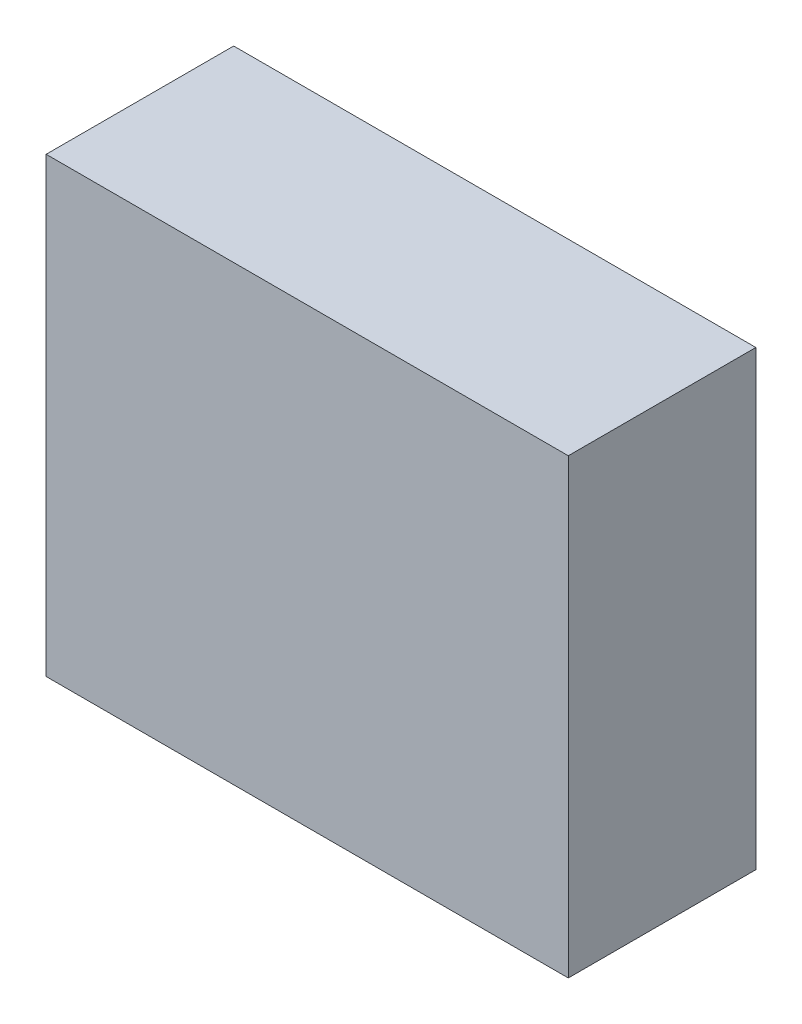
ISO-10303-21;
HEADER;
FILE_DESCRIPTION(('STEP AP214'),'2;1');
FILE_NAME('part.step','',(''),(''),'','','');
FILE_SCHEMA(('AUTOMOTIVE_DESIGN { 1 0 10303 214 1 1 1 1 }'));
ENDSEC;
DATA;
#1=APPLICATION_CONTEXT('core data for automotive mechanical design processes');
#2=APPLICATION_PROTOCOL_DEFINITION('international standard','automotive_design',2000,#1);
#3=PRODUCT_CONTEXT('',#1,'mechanical');
#4=PRODUCT('Part','Part','',(#3));
#5=PRODUCT_RELATED_PRODUCT_CATEGORY('part','',(#4));
#6=PRODUCT_DEFINITION_FORMATION('','',#4);
#7=PRODUCT_DEFINITION_CONTEXT('part definition',#1,'design');
#8=PRODUCT_DEFINITION('design','',#6,#7);
#9=PRODUCT_DEFINITION_SHAPE('','',#8);
#10=(LENGTH_UNIT() NAMED_UNIT(*) SI_UNIT(.MILLI.,.METRE.));
#11=(NAMED_UNIT(*) PLANE_ANGLE_UNIT() SI_UNIT($,.RADIAN.));
#12=(NAMED_UNIT(*) SI_UNIT($,.STERADIAN.) SOLID_ANGLE_UNIT());
#13=UNCERTAINTY_MEASURE_WITH_UNIT(LENGTH_MEASURE(1.E-05),#10,'distance_accuracy_value','');
#14=(GEOMETRIC_REPRESENTATION_CONTEXT(3) GLOBAL_UNCERTAINTY_ASSIGNED_CONTEXT((#13)) GLOBAL_UNIT_ASSIGNED_CONTEXT((#10,
#11,#12)) REPRESENTATION_CONTEXT('',''));
#15=CARTESIAN_POINT('',(0.,0.,0.));
#16=DIRECTION('',(0.,0.,1.));
#17=DIRECTION('',(1.,0.,0.));
#18=AXIS2_PLACEMENT_3D('',#15,#16,#17);
#19=CARTESIAN_POINT('',(-1.8034,-1.5748,0.));
#20=DIRECTION('',(0.,0.,-1.));
#21=DIRECTION('',(-1.,0.,0.));
#22=AXIS2_PLACEMENT_3D('',#19,#20,#21);
#23=PLANE('',#22);
#24=DIRECTION('',(1.,0.,0.));
#25=VECTOR('',#24,1.);
#26=CARTESIAN_POINT('',(-1.8034,1.5494,0.));
#27=LINE('',#26,#25);
#28=CARTESIAN_POINT('',(1.8034,1.5494,0.));
#29=VERTEX_POINT('',#28);
#30=CARTESIAN_POINT('',(-1.8034,1.5494,0.));
#31=VERTEX_POINT('',#30);
#32=EDGE_CURVE('E54',#29,#31,#27,.F.);
#33=ORIENTED_EDGE('',*,*,#32,.F.);
#34=DIRECTION('',(0.,1.,0.));
#35=VECTOR('',#34,1.);
#36=CARTESIAN_POINT('',(1.8034,1.5494,0.));
#37=LINE('',#36,#35);
#38=CARTESIAN_POINT('',(1.8034,-1.5748,0.));
#39=VERTEX_POINT('',#38);
#40=EDGE_CURVE('E19',#39,#29,#37,.T.);
#41=ORIENTED_EDGE('',*,*,#40,.F.);
#42=DIRECTION('',(1.,0.,0.));
#43=VECTOR('',#42,1.);
#44=CARTESIAN_POINT('',(1.8034,-1.5748,0.));
#45=LINE('',#44,#43);
#46=CARTESIAN_POINT('',(-1.8034,-1.5748,0.));
#47=VERTEX_POINT('',#46);
#48=EDGE_CURVE('E79',#47,#39,#45,.T.);
#49=ORIENTED_EDGE('',*,*,#48,.F.);
#50=DIRECTION('',(0.,1.,0.));
#51=VECTOR('',#50,1.);
#52=CARTESIAN_POINT('',(-1.8034,-1.5748,0.));
#53=LINE('',#52,#51);
#54=EDGE_CURVE('E67',#31,#47,#53,.F.);
#55=ORIENTED_EDGE('',*,*,#54,.F.);
#56=EDGE_LOOP('',(#33,#41,#49,#55));
#57=FACE_BOUND('',#56,.T.);
#58=ADVANCED_FACE('F16',(#57),#23,.T.);
#59=CARTESIAN_POINT('',(1.8034,1.5494,1.2954));
#60=DIRECTION('',(1.,0.,0.));
#61=DIRECTION('',(0.,0.,-1.));
#62=AXIS2_PLACEMENT_3D('',#59,#60,#61);
#63=PLANE('',#62);
#64=ORIENTED_EDGE('',*,*,#40,.T.);
#65=DIRECTION('',(0.,0.,1.));
#66=VECTOR('',#65,1.);
#67=CARTESIAN_POINT('',(1.8034,1.5494,1.2954));
#68=LINE('',#67,#66);
#69=CARTESIAN_POINT('',(1.8034,1.5494,1.2954));
#70=VERTEX_POINT('',#69);
#71=EDGE_CURVE('E60',#70,#29,#68,.F.);
#72=ORIENTED_EDGE('',*,*,#71,.F.);
#73=DIRECTION('',(0.,1.,0.));
#74=VECTOR('',#73,1.);
#75=CARTESIAN_POINT('',(1.8034,-1.5748,1.2954));
#76=LINE('',#75,#74);
#77=CARTESIAN_POINT('',(1.8034,-1.5748,1.2954));
#78=VERTEX_POINT('',#77);
#79=EDGE_CURVE('E82',#78,#70,#76,.T.);
#80=ORIENTED_EDGE('',*,*,#79,.F.);
#81=DIRECTION('',(0.,0.,-1.));
#82=VECTOR('',#81,1.);
#83=CARTESIAN_POINT('',(1.8034,-1.5748,1.2954));
#84=LINE('',#83,#82);
#85=EDGE_CURVE('E63',#39,#78,#84,.F.);
#86=ORIENTED_EDGE('',*,*,#85,.F.);
#87=EDGE_LOOP('',(#64,#72,#80,#86));
#88=FACE_BOUND('',#87,.T.);
#89=ADVANCED_FACE('F59',(#88),#63,.T.);
#90=CARTESIAN_POINT('',(-1.8034,1.5494,1.2954));
#91=DIRECTION('',(0.,1.,0.));
#92=DIRECTION('',(0.,0.,1.));
#93=AXIS2_PLACEMENT_3D('',#90,#91,#92);
#94=PLANE('',#93);
#95=ORIENTED_EDGE('',*,*,#32,.T.);
#96=DIRECTION('',(0.,0.,1.));
#97=VECTOR('',#96,1.);
#98=CARTESIAN_POINT('',(-1.8034,1.5494,1.2954));
#99=LINE('',#98,#97);
#100=CARTESIAN_POINT('',(-1.8034,1.5494,1.2954));
#101=VERTEX_POINT('',#100);
#102=EDGE_CURVE('E69',#101,#31,#99,.F.);
#103=ORIENTED_EDGE('',*,*,#102,.F.);
#104=DIRECTION('',(1.,0.,0.));
#105=VECTOR('',#104,1.);
#106=CARTESIAN_POINT('',(-1.8034,1.5494,1.2954));
#107=LINE('',#106,#105);
#108=EDGE_CURVE('E73',#70,#101,#107,.F.);
#109=ORIENTED_EDGE('',*,*,#108,.F.);
#110=ORIENTED_EDGE('',*,*,#71,.T.);
#111=EDGE_LOOP('',(#95,#103,#109,#110));
#112=FACE_BOUND('',#111,.T.);
#113=ADVANCED_FACE('F71',(#112),#94,.T.);
#114=CARTESIAN_POINT('',(-1.8034,-1.5748,1.2954));
#115=DIRECTION('',(-1.,0.,0.));
#116=DIRECTION('',(0.,0.,1.));
#117=AXIS2_PLACEMENT_3D('',#114,#115,#116);
#118=PLANE('',#117);
#119=ORIENTED_EDGE('',*,*,#54,.T.);
#120=DIRECTION('',(0.,0.,-1.));
#121=VECTOR('',#120,1.);
#122=CARTESIAN_POINT('',(-1.8034,-1.5748,1.2954));
#123=LINE('',#122,#121);
#124=CARTESIAN_POINT('',(-1.8034,-1.5748,1.2954));
#125=VERTEX_POINT('',#124);
#126=EDGE_CURVE('E34',#125,#47,#123,.T.);
#127=ORIENTED_EDGE('',*,*,#126,.F.);
#128=DIRECTION('',(0.,1.,0.));
#129=VECTOR('',#128,1.);
#130=CARTESIAN_POINT('',(-1.8034,-1.5748,1.2954));
#131=LINE('',#130,#129);
#132=EDGE_CURVE('E25',#101,#125,#131,.F.);
#133=ORIENTED_EDGE('',*,*,#132,.F.);
#134=ORIENTED_EDGE('',*,*,#102,.T.);
#135=EDGE_LOOP('',(#119,#127,#133,#134));
#136=FACE_BOUND('',#135,.T.);
#137=ADVANCED_FACE('F88',(#136),#118,.T.);
#138=CARTESIAN_POINT('',(1.8034,-1.5748,1.2954));
#139=DIRECTION('',(0.,-1.,0.));
#140=DIRECTION('',(0.,0.,-1.));
#141=AXIS2_PLACEMENT_3D('',#138,#139,#140);
#142=PLANE('',#141);
#143=ORIENTED_EDGE('',*,*,#48,.T.);
#144=ORIENTED_EDGE('',*,*,#85,.T.);
#145=DIRECTION('',(1.,0.,0.));
#146=VECTOR('',#145,1.);
#147=CARTESIAN_POINT('',(-1.8034,-1.5748,1.2954));
#148=LINE('',#147,#146);
#149=EDGE_CURVE('E11',#125,#78,#148,.T.);
#150=ORIENTED_EDGE('',*,*,#149,.F.);
#151=ORIENTED_EDGE('',*,*,#126,.T.);
#152=EDGE_LOOP('',(#143,#144,#150,#151));
#153=FACE_BOUND('',#152,.T.);
#154=ADVANCED_FACE('F90',(#153),#142,.T.);
#155=CARTESIAN_POINT('',(-1.8034,-1.5748,1.2954));
#156=DIRECTION('',(0.,0.,1.));
#157=DIRECTION('',(1.,0.,0.));
#158=AXIS2_PLACEMENT_3D('',#155,#156,#157);
#159=PLANE('',#158);
#160=ORIENTED_EDGE('',*,*,#132,.T.);
#161=ORIENTED_EDGE('',*,*,#149,.T.);
#162=ORIENTED_EDGE('',*,*,#79,.T.);
#163=ORIENTED_EDGE('',*,*,#108,.T.);
#164=EDGE_LOOP('',(#160,#161,#162,#163));
#165=FACE_BOUND('',#164,.T.);
#166=ADVANCED_FACE('F87',(#165),#159,.T.);
#167=CLOSED_SHELL('',(#58,#89,#113,#137,#154,#166));
#168=MANIFOLD_SOLID_BREP('B1',#167);
#169=ADVANCED_BREP_SHAPE_REPRESENTATION('',(#18,#168),#14);
#170=SHAPE_DEFINITION_REPRESENTATION(#9,#169);
ENDSEC;
END-ISO-10303-21;
